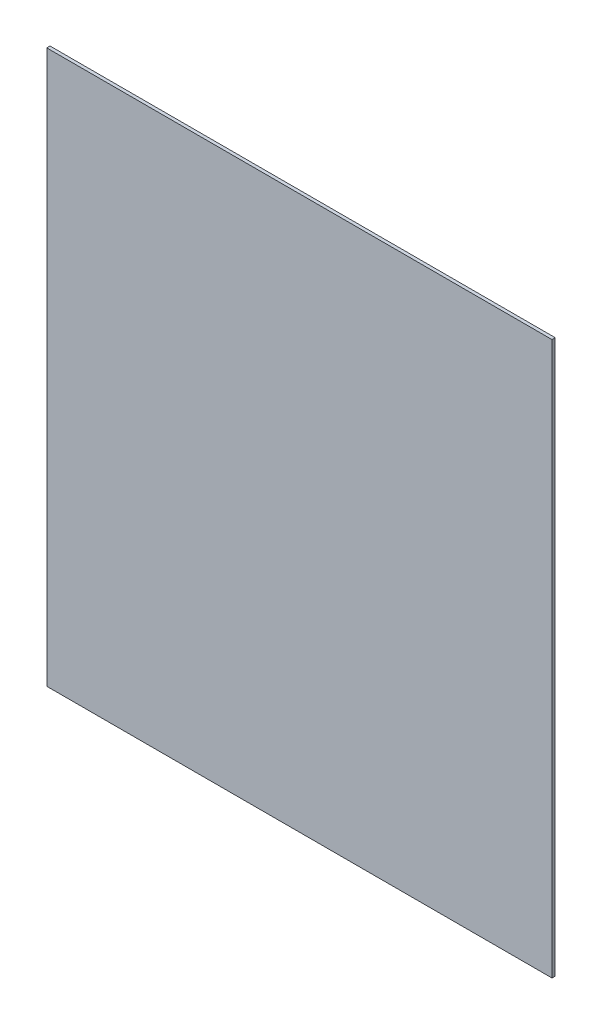
ISO-10303-21;
HEADER;
FILE_DESCRIPTION(('STEP AP214'),'2;1');
FILE_NAME('part.step','',(''),(''),'','','');
FILE_SCHEMA(('AUTOMOTIVE_DESIGN { 1 0 10303 214 1 1 1 1 }'));
ENDSEC;
DATA;
#1=APPLICATION_CONTEXT('core data for automotive mechanical design processes');
#2=APPLICATION_PROTOCOL_DEFINITION('international standard','automotive_design',2000,#1);
#3=PRODUCT_CONTEXT('',#1,'mechanical');
#4=PRODUCT('Part','Part','',(#3));
#5=PRODUCT_RELATED_PRODUCT_CATEGORY('part','',(#4));
#6=PRODUCT_DEFINITION_FORMATION('','',#4);
#7=PRODUCT_DEFINITION_CONTEXT('part definition',#1,'design');
#8=PRODUCT_DEFINITION('design','',#6,#7);
#9=PRODUCT_DEFINITION_SHAPE('','',#8);
#10=(LENGTH_UNIT() NAMED_UNIT(*) SI_UNIT(.MILLI.,.METRE.));
#11=(NAMED_UNIT(*) PLANE_ANGLE_UNIT() SI_UNIT($,.RADIAN.));
#12=(NAMED_UNIT(*) SI_UNIT($,.STERADIAN.) SOLID_ANGLE_UNIT());
#13=UNCERTAINTY_MEASURE_WITH_UNIT(LENGTH_MEASURE(1.E-05),#10,'distance_accuracy_value','');
#14=(GEOMETRIC_REPRESENTATION_CONTEXT(3) GLOBAL_UNCERTAINTY_ASSIGNED_CONTEXT((#13)) GLOBAL_UNIT_ASSIGNED_CONTEXT((#10,
#11,#12)) REPRESENTATION_CONTEXT('',''));
#15=CARTESIAN_POINT('',(0.,0.,0.));
#16=DIRECTION('',(0.,0.,1.));
#17=DIRECTION('',(1.,0.,0.));
#18=AXIS2_PLACEMENT_3D('',#15,#16,#17);
#19=CARTESIAN_POINT('',(233.,255.,3.));
#20=DIRECTION('',(-1.,0.,0.));
#21=DIRECTION('',(0.,-1.,0.));
#22=AXIS2_PLACEMENT_3D('',#19,#20,#21);
#23=PLANE('',#22);
#24=DIRECTION('',(0.,1.,0.));
#25=VECTOR('',#24,1.);
#26=CARTESIAN_POINT('',(233.,255.,0.));
#27=LINE('',#26,#25);
#28=CARTESIAN_POINT('',(233.,-255.,0.));
#29=VERTEX_POINT('',#28);
#30=CARTESIAN_POINT('',(233.,255.,0.));
#31=VERTEX_POINT('',#30);
#32=EDGE_CURVE('E96',#29,#31,#27,.T.);
#33=ORIENTED_EDGE('',*,*,#32,.T.);
#34=DIRECTION('',(0.,0.,-1.));
#35=VECTOR('',#34,1.);
#36=CARTESIAN_POINT('',(233.,255.,3.));
#37=LINE('',#36,#35);
#38=CARTESIAN_POINT('',(233.,255.,3.));
#39=VERTEX_POINT('',#38);
#40=EDGE_CURVE('E11',#39,#31,#37,.T.);
#41=ORIENTED_EDGE('',*,*,#40,.F.);
#42=DIRECTION('',(0.,1.,0.));
#43=VECTOR('',#42,1.);
#44=CARTESIAN_POINT('',(233.,255.,3.));
#45=LINE('',#44,#43);
#46=CARTESIAN_POINT('',(233.,-255.,3.));
#47=VERTEX_POINT('',#46);
#48=EDGE_CURVE('E84',#47,#39,#45,.T.);
#49=ORIENTED_EDGE('',*,*,#48,.F.);
#50=DIRECTION('',(0.,0.,-1.));
#51=VECTOR('',#50,1.);
#52=CARTESIAN_POINT('',(233.,-255.,3.));
#53=LINE('',#52,#51);
#54=EDGE_CURVE('E92',#47,#29,#53,.T.);
#55=ORIENTED_EDGE('',*,*,#54,.T.);
#56=EDGE_LOOP('',(#33,#41,#49,#55));
#57=FACE_BOUND('',#56,.T.);
#58=ADVANCED_FACE('F33',(#57),#23,.F.);
#59=CARTESIAN_POINT('',(-233.,255.,3.));
#60=DIRECTION('',(0.,-1.,0.));
#61=DIRECTION('',(0.,0.,-1.));
#62=AXIS2_PLACEMENT_3D('',#59,#60,#61);
#63=PLANE('',#62);
#64=DIRECTION('',(-1.,0.,0.));
#65=VECTOR('',#64,1.);
#66=CARTESIAN_POINT('',(-233.,255.,0.));
#67=LINE('',#66,#65);
#68=CARTESIAN_POINT('',(-233.,255.,0.));
#69=VERTEX_POINT('',#68);
#70=EDGE_CURVE('E88',#31,#69,#67,.T.);
#71=ORIENTED_EDGE('',*,*,#70,.T.);
#72=DIRECTION('',(0.,0.,-1.));
#73=VECTOR('',#72,1.);
#74=CARTESIAN_POINT('',(-233.,255.,3.));
#75=LINE('',#74,#73);
#76=CARTESIAN_POINT('',(-233.,255.,3.));
#77=VERTEX_POINT('',#76);
#78=EDGE_CURVE('E41',#77,#69,#75,.T.);
#79=ORIENTED_EDGE('',*,*,#78,.F.);
#80=DIRECTION('',(-1.,0.,0.));
#81=VECTOR('',#80,1.);
#82=CARTESIAN_POINT('',(-233.,255.,3.));
#83=LINE('',#82,#81);
#84=EDGE_CURVE('E79',#39,#77,#83,.T.);
#85=ORIENTED_EDGE('',*,*,#84,.F.);
#86=ORIENTED_EDGE('',*,*,#40,.T.);
#87=EDGE_LOOP('',(#71,#79,#85,#86));
#88=FACE_BOUND('',#87,.T.);
#89=ADVANCED_FACE('F87',(#88),#63,.F.);
#90=CARTESIAN_POINT('',(-233.,255.,3.));
#91=DIRECTION('',(1.,0.,0.));
#92=DIRECTION('',(0.,1.,0.));
#93=AXIS2_PLACEMENT_3D('',#90,#91,#92);
#94=PLANE('',#93);
#95=DIRECTION('',(0.,-1.,0.));
#96=VECTOR('',#95,1.);
#97=CARTESIAN_POINT('',(-233.,255.,0.));
#98=LINE('',#97,#96);
#99=CARTESIAN_POINT('',(-233.,-255.,0.));
#100=VERTEX_POINT('',#99);
#101=EDGE_CURVE('E66',#69,#100,#98,.T.);
#102=ORIENTED_EDGE('',*,*,#101,.T.);
#103=DIRECTION('',(0.,0.,-1.));
#104=VECTOR('',#103,1.);
#105=CARTESIAN_POINT('',(-233.,-255.,3.));
#106=LINE('',#105,#104);
#107=CARTESIAN_POINT('',(-233.,-255.,3.));
#108=VERTEX_POINT('',#107);
#109=EDGE_CURVE('E89',#108,#100,#106,.T.);
#110=ORIENTED_EDGE('',*,*,#109,.F.);
#111=DIRECTION('',(0.,-1.,0.));
#112=VECTOR('',#111,1.);
#113=CARTESIAN_POINT('',(-233.,255.,3.));
#114=LINE('',#113,#112);
#115=EDGE_CURVE('E82',#77,#108,#114,.T.);
#116=ORIENTED_EDGE('',*,*,#115,.F.);
#117=ORIENTED_EDGE('',*,*,#78,.T.);
#118=EDGE_LOOP('',(#102,#110,#116,#117));
#119=FACE_BOUND('',#118,.T.);
#120=ADVANCED_FACE('F90',(#119),#94,.F.);
#121=CARTESIAN_POINT('',(-233.,-255.,3.));
#122=DIRECTION('',(0.,1.,0.));
#123=DIRECTION('',(0.,0.,1.));
#124=AXIS2_PLACEMENT_3D('',#121,#122,#123);
#125=PLANE('',#124);
#126=DIRECTION('',(1.,0.,0.));
#127=VECTOR('',#126,1.);
#128=CARTESIAN_POINT('',(-233.,-255.,0.));
#129=LINE('',#128,#127);
#130=EDGE_CURVE('E72',#100,#29,#129,.T.);
#131=ORIENTED_EDGE('',*,*,#130,.T.);
#132=ORIENTED_EDGE('',*,*,#54,.F.);
#133=DIRECTION('',(1.,0.,0.));
#134=VECTOR('',#133,1.);
#135=CARTESIAN_POINT('',(-233.,-255.,3.));
#136=LINE('',#135,#134);
#137=EDGE_CURVE('E49',#108,#47,#136,.T.);
#138=ORIENTED_EDGE('',*,*,#137,.F.);
#139=ORIENTED_EDGE('',*,*,#109,.T.);
#140=EDGE_LOOP('',(#131,#132,#138,#139));
#141=FACE_BOUND('',#140,.T.);
#142=ADVANCED_FACE('F103',(#141),#125,.F.);
#143=CARTESIAN_POINT('',(0.,0.,3.));
#144=DIRECTION('',(0.,0.,1.));
#145=DIRECTION('',(1.,0.,0.));
#146=AXIS2_PLACEMENT_3D('',#143,#144,#145);
#147=PLANE('',#146);
#148=ORIENTED_EDGE('',*,*,#48,.T.);
#149=ORIENTED_EDGE('',*,*,#84,.T.);
#150=ORIENTED_EDGE('',*,*,#115,.T.);
#151=ORIENTED_EDGE('',*,*,#137,.T.);
#152=EDGE_LOOP('',(#148,#149,#150,#151));
#153=FACE_BOUND('',#152,.T.);
#154=ADVANCED_FACE('F80',(#153),#147,.T.);
#155=CARTESIAN_POINT('',(0.,0.,0.));
#156=DIRECTION('',(0.,0.,1.));
#157=DIRECTION('',(1.,0.,0.));
#158=AXIS2_PLACEMENT_3D('',#155,#156,#157);
#159=PLANE('',#158);
#160=ORIENTED_EDGE('',*,*,#32,.F.);
#161=ORIENTED_EDGE('',*,*,#130,.F.);
#162=ORIENTED_EDGE('',*,*,#101,.F.);
#163=ORIENTED_EDGE('',*,*,#70,.F.);
#164=EDGE_LOOP('',(#160,#161,#162,#163));
#165=FACE_BOUND('',#164,.T.);
#166=ADVANCED_FACE('F106',(#165),#159,.F.);
#167=CLOSED_SHELL('',(#58,#89,#120,#142,#154,#166));
#168=MANIFOLD_SOLID_BREP('B2',#167);
#169=ADVANCED_BREP_SHAPE_REPRESENTATION('',(#18,#168),#14);
#170=SHAPE_DEFINITION_REPRESENTATION(#9,#169);
ENDSEC;
END-ISO-10303-21;
